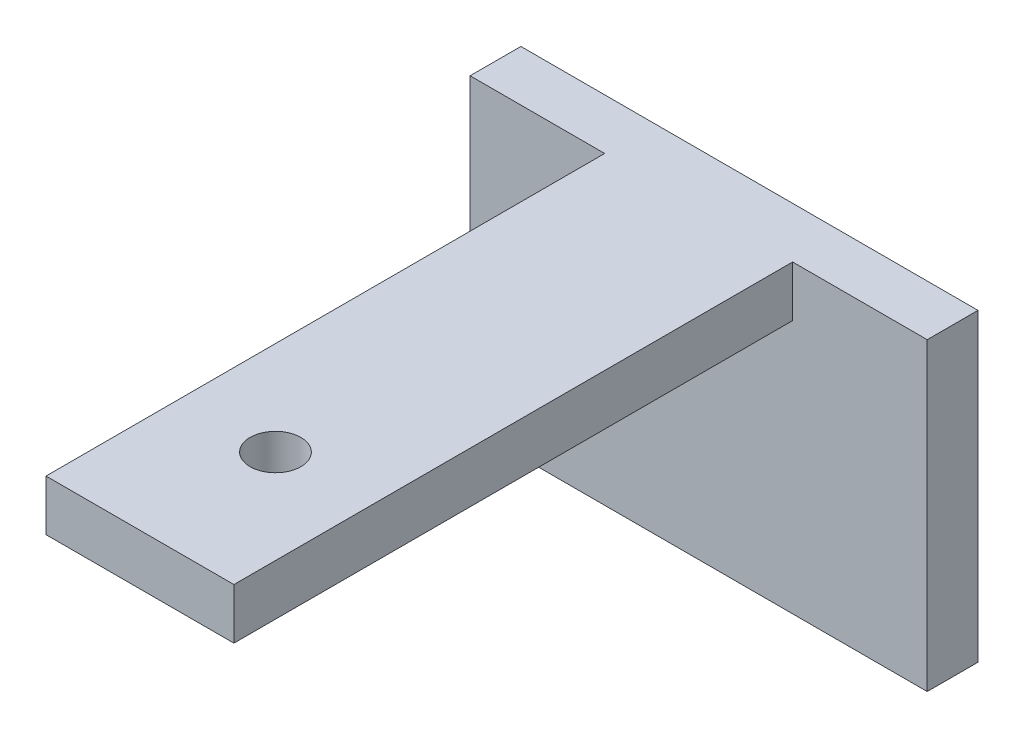
ISO-10303-21;
HEADER;
FILE_DESCRIPTION(('STEP AP214'),'2;1');
FILE_NAME('part.step','',(''),(''),'','','');
FILE_SCHEMA(('AUTOMOTIVE_DESIGN { 1 0 10303 214 1 1 1 1 }'));
ENDSEC;
DATA;
#1=APPLICATION_CONTEXT('core data for automotive mechanical design processes');
#2=APPLICATION_PROTOCOL_DEFINITION('international standard','automotive_design',2000,#1);
#3=PRODUCT_CONTEXT('',#1,'mechanical');
#4=PRODUCT('Part','Part','',(#3));
#5=PRODUCT_RELATED_PRODUCT_CATEGORY('part','',(#4));
#6=PRODUCT_DEFINITION_FORMATION('','',#4);
#7=PRODUCT_DEFINITION_CONTEXT('part definition',#1,'design');
#8=PRODUCT_DEFINITION('design','',#6,#7);
#9=PRODUCT_DEFINITION_SHAPE('','',#8);
#10=(LENGTH_UNIT() NAMED_UNIT(*) SI_UNIT(.MILLI.,.METRE.));
#11=(NAMED_UNIT(*) PLANE_ANGLE_UNIT() SI_UNIT($,.RADIAN.));
#12=(NAMED_UNIT(*) SI_UNIT($,.STERADIAN.) SOLID_ANGLE_UNIT());
#13=UNCERTAINTY_MEASURE_WITH_UNIT(LENGTH_MEASURE(1.E-05),#10,'distance_accuracy_value','');
#14=(GEOMETRIC_REPRESENTATION_CONTEXT(3) GLOBAL_UNCERTAINTY_ASSIGNED_CONTEXT((#13)) GLOBAL_UNIT_ASSIGNED_CONTEXT((#10,
#11,#12)) REPRESENTATION_CONTEXT('',''));
#15=CARTESIAN_POINT('',(0.,0.,0.));
#16=DIRECTION('',(0.,0.,1.));
#17=DIRECTION('',(1.,0.,0.));
#18=AXIS2_PLACEMENT_3D('',#15,#16,#17);
#19=CARTESIAN_POINT('',(-22.5,-15.,5.));
#20=DIRECTION('',(1.,0.,0.));
#21=DIRECTION('',(0.,0.,-1.));
#22=AXIS2_PLACEMENT_3D('',#19,#20,#21);
#23=PLANE('',#22);
#24=DIRECTION('',(0.,-1.,0.));
#25=VECTOR('',#24,1.);
#26=CARTESIAN_POINT('',(-22.5,-15.,0.));
#27=LINE('',#26,#25);
#28=CARTESIAN_POINT('',(-22.5,15.,0.));
#29=VERTEX_POINT('',#28);
#30=CARTESIAN_POINT('',(-22.5,-15.,0.));
#31=VERTEX_POINT('',#30);
#32=EDGE_CURVE('E131',#29,#31,#27,.T.);
#33=ORIENTED_EDGE('',*,*,#32,.T.);
#34=DIRECTION('',(0.,0.,-1.));
#35=VECTOR('',#34,1.);
#36=CARTESIAN_POINT('',(-22.5,-15.,5.));
#37=LINE('',#36,#35);
#38=CARTESIAN_POINT('',(-22.5,-15.,5.));
#39=VERTEX_POINT('',#38);
#40=EDGE_CURVE('E11',#39,#31,#37,.T.);
#41=ORIENTED_EDGE('',*,*,#40,.F.);
#42=DIRECTION('',(0.,-1.,0.));
#43=VECTOR('',#42,1.);
#44=CARTESIAN_POINT('',(-22.5,-15.,5.));
#45=LINE('',#44,#43);
#46=CARTESIAN_POINT('',(-22.5,15.,5.));
#47=VERTEX_POINT('',#46);
#48=EDGE_CURVE('E142',#47,#39,#45,.T.);
#49=ORIENTED_EDGE('',*,*,#48,.F.);
#50=DIRECTION('',(0.,0.,-1.));
#51=VECTOR('',#50,1.);
#52=CARTESIAN_POINT('',(-22.5,15.,5.));
#53=LINE('',#52,#51);
#54=EDGE_CURVE('E156',#47,#29,#53,.T.);
#55=ORIENTED_EDGE('',*,*,#54,.T.);
#56=EDGE_LOOP('',(#33,#41,#49,#55));
#57=FACE_BOUND('',#56,.T.);
#58=ADVANCED_FACE('F42',(#57),#23,.F.);
#59=CARTESIAN_POINT('',(22.5,-15.,5.));
#60=DIRECTION('',(0.,1.,0.));
#61=DIRECTION('',(-1.,0.,0.));
#62=AXIS2_PLACEMENT_3D('',#59,#60,#61);
#63=PLANE('',#62);
#64=DIRECTION('',(1.,0.,0.));
#65=VECTOR('',#64,1.);
#66=CARTESIAN_POINT('',(22.5,-15.,0.));
#67=LINE('',#66,#65);
#68=CARTESIAN_POINT('',(22.5,-15.,0.));
#69=VERTEX_POINT('',#68);
#70=EDGE_CURVE('E136',#31,#69,#67,.T.);
#71=ORIENTED_EDGE('',*,*,#70,.T.);
#72=DIRECTION('',(0.,0.,-1.));
#73=VECTOR('',#72,1.);
#74=CARTESIAN_POINT('',(22.5,-15.,5.));
#75=LINE('',#74,#73);
#76=CARTESIAN_POINT('',(22.5,-15.,5.));
#77=VERTEX_POINT('',#76);
#78=EDGE_CURVE('E51',#77,#69,#75,.T.);
#79=ORIENTED_EDGE('',*,*,#78,.F.);
#80=DIRECTION('',(1.,0.,0.));
#81=VECTOR('',#80,1.);
#82=CARTESIAN_POINT('',(22.5,-15.,5.));
#83=LINE('',#82,#81);
#84=EDGE_CURVE('E146',#39,#77,#83,.T.);
#85=ORIENTED_EDGE('',*,*,#84,.F.);
#86=ORIENTED_EDGE('',*,*,#40,.T.);
#87=EDGE_LOOP('',(#71,#79,#85,#86));
#88=FACE_BOUND('',#87,.T.);
#89=ADVANCED_FACE('F232',(#88),#63,.F.);
#90=CARTESIAN_POINT('',(22.5,-15.,5.));
#91=DIRECTION('',(-1.,0.,0.));
#92=DIRECTION('',(0.,0.,1.));
#93=AXIS2_PLACEMENT_3D('',#90,#91,#92);
#94=PLANE('',#93);
#95=DIRECTION('',(0.,1.,0.));
#96=VECTOR('',#95,1.);
#97=CARTESIAN_POINT('',(22.5,-15.,0.));
#98=LINE('',#97,#96);
#99=CARTESIAN_POINT('',(22.5,15.,0.));
#100=VERTEX_POINT('',#99);
#101=EDGE_CURVE('E160',#69,#100,#98,.T.);
#102=ORIENTED_EDGE('',*,*,#101,.T.);
#103=DIRECTION('',(0.,0.,-1.));
#104=VECTOR('',#103,1.);
#105=CARTESIAN_POINT('',(22.5,15.,5.));
#106=LINE('',#105,#104);
#107=CARTESIAN_POINT('',(22.5,15.,5.));
#108=VERTEX_POINT('',#107);
#109=EDGE_CURVE('E168',#108,#100,#106,.T.);
#110=ORIENTED_EDGE('',*,*,#109,.F.);
#111=DIRECTION('',(0.,1.,0.));
#112=VECTOR('',#111,1.);
#113=CARTESIAN_POINT('',(22.5,-15.,5.));
#114=LINE('',#113,#112);
#115=EDGE_CURVE('E150',#77,#108,#114,.T.);
#116=ORIENTED_EDGE('',*,*,#115,.F.);
#117=ORIENTED_EDGE('',*,*,#78,.T.);
#118=EDGE_LOOP('',(#102,#110,#116,#117));
#119=FACE_BOUND('',#118,.T.);
#120=ADVANCED_FACE('F178',(#119),#94,.F.);
#121=CARTESIAN_POINT('',(22.5,15.,5.));
#122=DIRECTION('',(0.,-1.,0.));
#123=DIRECTION('',(1.,0.,0.));
#124=AXIS2_PLACEMENT_3D('',#121,#122,#123);
#125=PLANE('',#124);
#126=CARTESIAN_POINT('',(0.,15.,46.66));
#127=DIRECTION('',(0.,1.,0.));
#128=DIRECTION('',(-1.,0.,0.));
#129=AXIS2_PLACEMENT_3D('',#126,#127,#128);
#130=CIRCLE('',#129,2.5);
#131=CARTESIAN_POINT('',(-2.5,15.,46.66));
#132=VERTEX_POINT('',#131);
#133=EDGE_CURVE('E214',#132,#132,#130,.T.);
#134=ORIENTED_EDGE('',*,*,#133,.F.);
#135=EDGE_LOOP('',(#134));
#136=FACE_BOUND('',#135,.T.);
#137=DIRECTION('',(-1.,0.,0.));
#138=VECTOR('',#137,1.);
#139=CARTESIAN_POINT('',(22.5,15.,0.));
#140=LINE('',#139,#138);
#141=EDGE_CURVE('E147',#100,#29,#140,.T.);
#142=ORIENTED_EDGE('',*,*,#141,.T.);
#143=ORIENTED_EDGE('',*,*,#54,.F.);
#144=DIRECTION('',(-1.,0.,0.));
#145=VECTOR('',#144,1.);
#146=CARTESIAN_POINT('',(22.5,15.,5.));
#147=LINE('',#146,#145);
#148=CARTESIAN_POINT('',(-9.24999999999999,15.,5.));
#149=VERTEX_POINT('',#148);
#150=EDGE_CURVE('E153',#149,#47,#147,.T.);
#151=ORIENTED_EDGE('',*,*,#150,.F.);
#152=DIRECTION('',(0.,0.,-1.));
#153=VECTOR('',#152,1.);
#154=CARTESIAN_POINT('',(-9.25000000000001,15.,60.));
#155=LINE('',#154,#153);
#156=CARTESIAN_POINT('',(-9.25000000000001,15.,60.));
#157=VERTEX_POINT('',#156);
#158=EDGE_CURVE('E138',#157,#149,#155,.T.);
#159=ORIENTED_EDGE('',*,*,#158,.F.);
#160=DIRECTION('',(-1.,0.,0.));
#161=VECTOR('',#160,1.);
#162=CARTESIAN_POINT('',(-9.25000000000001,15.,60.));
#163=LINE('',#162,#161);
#164=CARTESIAN_POINT('',(9.24999999999999,15.,60.));
#165=VERTEX_POINT('',#164);
#166=EDGE_CURVE('E116',#165,#157,#163,.T.);
#167=ORIENTED_EDGE('',*,*,#166,.F.);
#168=DIRECTION('',(0.,0.,-1.));
#169=VECTOR('',#168,1.);
#170=CARTESIAN_POINT('',(9.24999999999999,15.,60.));
#171=LINE('',#170,#169);
#172=CARTESIAN_POINT('',(9.24999999999999,15.,5.));
#173=VERTEX_POINT('',#172);
#174=EDGE_CURVE('E112',#165,#173,#171,.T.);
#175=ORIENTED_EDGE('',*,*,#174,.T.);
#176=EDGE_CURVE('E154',#108,#173,#147,.T.);
#177=ORIENTED_EDGE('',*,*,#176,.F.);
#178=ORIENTED_EDGE('',*,*,#109,.T.);
#179=EDGE_LOOP('',(#142,#143,#151,#159,#167,#175,#177,#178));
#180=FACE_BOUND('',#179,.T.);
#181=ADVANCED_FACE('F187',(#136,#180),#125,.F.);
#182=CARTESIAN_POINT('',(0.,0.,5.));
#183=DIRECTION('',(0.,0.,1.));
#184=DIRECTION('',(1.,0.,0.));
#185=AXIS2_PLACEMENT_3D('',#182,#183,#184);
#186=PLANE('',#185);
#187=DIRECTION('',(0.,-1.,0.));
#188=VECTOR('',#187,1.);
#189=CARTESIAN_POINT('',(-9.25000000000001,10.,5.));
#190=LINE('',#189,#188);
#191=CARTESIAN_POINT('',(-9.25000000000001,10.,5.));
#192=VERTEX_POINT('',#191);
#193=EDGE_CURVE('E127',#149,#192,#190,.T.);
#194=ORIENTED_EDGE('',*,*,#193,.F.);
#195=ORIENTED_EDGE('',*,*,#150,.T.);
#196=ORIENTED_EDGE('',*,*,#48,.T.);
#197=ORIENTED_EDGE('',*,*,#84,.T.);
#198=ORIENTED_EDGE('',*,*,#115,.T.);
#199=ORIENTED_EDGE('',*,*,#176,.T.);
#200=DIRECTION('',(0.,1.,0.));
#201=VECTOR('',#200,1.);
#202=CARTESIAN_POINT('',(9.24999999999999,15.,5.));
#203=LINE('',#202,#201);
#204=CARTESIAN_POINT('',(9.24999999999999,10.,5.));
#205=VERTEX_POINT('',#204);
#206=EDGE_CURVE('E63',#205,#173,#203,.T.);
#207=ORIENTED_EDGE('',*,*,#206,.F.);
#208=DIRECTION('',(1.,0.,0.));
#209=VECTOR('',#208,1.);
#210=CARTESIAN_POINT('',(9.24999999999999,10.,5.));
#211=LINE('',#210,#209);
#212=EDGE_CURVE('E58',#192,#205,#211,.T.);
#213=ORIENTED_EDGE('',*,*,#212,.F.);
#214=EDGE_LOOP('',(#194,#195,#196,#197,#198,#199,#207,#213));
#215=FACE_BOUND('',#214,.T.);
#216=ADVANCED_FACE('F193',(#215),#186,.T.);
#217=CARTESIAN_POINT('',(0.,0.,0.));
#218=DIRECTION('',(0.,0.,1.));
#219=DIRECTION('',(1.,0.,0.));
#220=AXIS2_PLACEMENT_3D('',#217,#218,#219);
#221=PLANE('',#220);
#222=ORIENTED_EDGE('',*,*,#32,.F.);
#223=ORIENTED_EDGE('',*,*,#141,.F.);
#224=ORIENTED_EDGE('',*,*,#101,.F.);
#225=ORIENTED_EDGE('',*,*,#70,.F.);
#226=EDGE_LOOP('',(#222,#223,#224,#225));
#227=FACE_BOUND('',#226,.T.);
#228=ADVANCED_FACE('F184',(#227),#221,.F.);
#229=CARTESIAN_POINT('',(9.24999999999999,10.,60.));
#230=DIRECTION('',(0.,1.,0.));
#231=DIRECTION('',(-1.,0.,0.));
#232=AXIS2_PLACEMENT_3D('',#229,#230,#231);
#233=PLANE('',#232);
#234=CARTESIAN_POINT('',(0.,10.,46.66));
#235=DIRECTION('',(0.,1.,0.));
#236=DIRECTION('',(-1.,0.,0.));
#237=AXIS2_PLACEMENT_3D('',#234,#235,#236);
#238=CIRCLE('',#237,2.5);
#239=CARTESIAN_POINT('',(-2.5,10.,46.66));
#240=VERTEX_POINT('',#239);
#241=EDGE_CURVE('E45',#240,#240,#238,.T.);
#242=ORIENTED_EDGE('',*,*,#241,.T.);
#243=EDGE_LOOP('',(#242));
#244=FACE_BOUND('',#243,.T.);
#245=ORIENTED_EDGE('',*,*,#212,.T.);
#246=DIRECTION('',(0.,0.,-1.));
#247=VECTOR('',#246,1.);
#248=CARTESIAN_POINT('',(9.24999999999999,10.,60.));
#249=LINE('',#248,#247);
#250=CARTESIAN_POINT('',(9.24999999999999,10.,60.));
#251=VERTEX_POINT('',#250);
#252=EDGE_CURVE('E110',#251,#205,#249,.T.);
#253=ORIENTED_EDGE('',*,*,#252,.F.);
#254=DIRECTION('',(1.,0.,0.));
#255=VECTOR('',#254,1.);
#256=CARTESIAN_POINT('',(9.24999999999999,10.,60.));
#257=LINE('',#256,#255);
#258=CARTESIAN_POINT('',(-9.25000000000001,10.,60.));
#259=VERTEX_POINT('',#258);
#260=EDGE_CURVE('E117',#259,#251,#257,.T.);
#261=ORIENTED_EDGE('',*,*,#260,.F.);
#262=DIRECTION('',(0.,0.,-1.));
#263=VECTOR('',#262,1.);
#264=CARTESIAN_POINT('',(-9.25000000000001,10.,60.));
#265=LINE('',#264,#263);
#266=EDGE_CURVE('E200',#259,#192,#265,.T.);
#267=ORIENTED_EDGE('',*,*,#266,.T.);
#268=EDGE_LOOP('',(#245,#253,#261,#267));
#269=FACE_BOUND('',#268,.T.);
#270=ADVANCED_FACE('F129',(#244,#269),#233,.F.);
#271=CARTESIAN_POINT('',(9.24999999999999,15.,60.));
#272=DIRECTION('',(-1.,0.,0.));
#273=DIRECTION('',(0.,0.,1.));
#274=AXIS2_PLACEMENT_3D('',#271,#272,#273);
#275=PLANE('',#274);
#276=ORIENTED_EDGE('',*,*,#206,.T.);
#277=ORIENTED_EDGE('',*,*,#174,.F.);
#278=DIRECTION('',(0.,1.,0.));
#279=VECTOR('',#278,1.);
#280=CARTESIAN_POINT('',(9.24999999999999,15.,60.));
#281=LINE('',#280,#279);
#282=EDGE_CURVE('E106',#251,#165,#281,.T.);
#283=ORIENTED_EDGE('',*,*,#282,.F.);
#284=ORIENTED_EDGE('',*,*,#252,.T.);
#285=EDGE_LOOP('',(#276,#277,#283,#284));
#286=FACE_BOUND('',#285,.T.);
#287=ADVANCED_FACE('F108',(#286),#275,.F.);
#288=CARTESIAN_POINT('',(-9.25000000000001,10.,60.));
#289=DIRECTION('',(1.,0.,0.));
#290=DIRECTION('',(0.,0.,-1.));
#291=AXIS2_PLACEMENT_3D('',#288,#289,#290);
#292=PLANE('',#291);
#293=ORIENTED_EDGE('',*,*,#193,.T.);
#294=ORIENTED_EDGE('',*,*,#266,.F.);
#295=DIRECTION('',(0.,-1.,0.));
#296=VECTOR('',#295,1.);
#297=CARTESIAN_POINT('',(-9.25000000000001,10.,60.));
#298=LINE('',#297,#296);
#299=EDGE_CURVE('E122',#157,#259,#298,.T.);
#300=ORIENTED_EDGE('',*,*,#299,.F.);
#301=ORIENTED_EDGE('',*,*,#158,.T.);
#302=EDGE_LOOP('',(#293,#294,#300,#301));
#303=FACE_BOUND('',#302,.T.);
#304=ADVANCED_FACE('F198',(#303),#292,.F.);
#305=CARTESIAN_POINT('',(0.,0.,60.));
#306=DIRECTION('',(0.,0.,-1.));
#307=DIRECTION('',(-1.,0.,0.));
#308=AXIS2_PLACEMENT_3D('',#305,#306,#307);
#309=PLANE('',#308);
#310=ORIENTED_EDGE('',*,*,#260,.T.);
#311=ORIENTED_EDGE('',*,*,#282,.T.);
#312=ORIENTED_EDGE('',*,*,#166,.T.);
#313=ORIENTED_EDGE('',*,*,#299,.T.);
#314=EDGE_LOOP('',(#310,#311,#312,#313));
#315=FACE_BOUND('',#314,.T.);
#316=ADVANCED_FACE('F120',(#315),#309,.F.);
#317=CARTESIAN_POINT('',(0.,5.,46.66));
#318=DIRECTION('',(0.,1.,0.));
#319=DIRECTION('',(-1.,0.,0.));
#320=AXIS2_PLACEMENT_3D('',#317,#318,#319);
#321=CYLINDRICAL_SURFACE('',#320,2.5);
#322=ORIENTED_EDGE('',*,*,#133,.T.);
#323=EDGE_LOOP('',(#322));
#324=FACE_BOUND('',#323,.T.);
#325=ORIENTED_EDGE('',*,*,#241,.F.);
#326=EDGE_LOOP('',(#325));
#327=FACE_BOUND('',#326,.T.);
#328=ADVANCED_FACE('F224',(#324,#327),#321,.F.);
#329=CLOSED_SHELL('',(#58,#89,#120,#181,#216,#228,#270,#287,#304,#316,#328));
#330=MANIFOLD_SOLID_BREP('B2',#329);
#331=ADVANCED_BREP_SHAPE_REPRESENTATION('',(#18,#330),#14);
#332=SHAPE_DEFINITION_REPRESENTATION(#9,#331);
ENDSEC;
END-ISO-10303-21;
